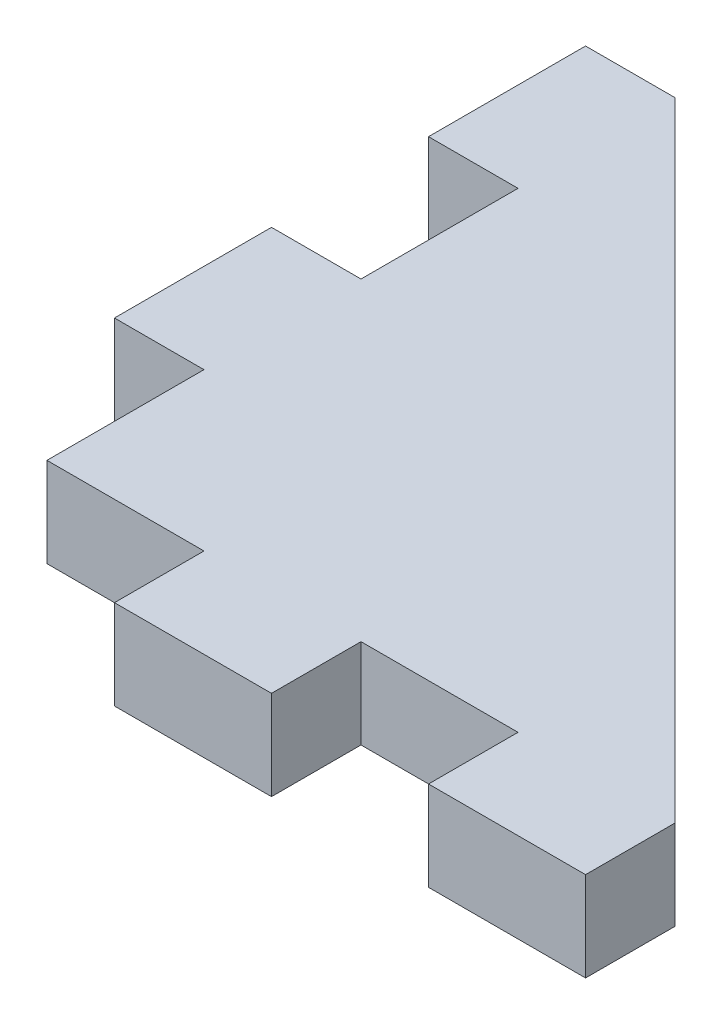
ISO-10303-21;
HEADER;
FILE_DESCRIPTION(('STEP AP214'),'2;1');
FILE_NAME('part.step','',(''),(''),'','','');
FILE_SCHEMA(('AUTOMOTIVE_DESIGN { 1 0 10303 214 1 1 1 1 }'));
ENDSEC;
DATA;
#1=APPLICATION_CONTEXT('core data for automotive mechanical design processes');
#2=APPLICATION_PROTOCOL_DEFINITION('international standard','automotive_design',2000,#1);
#3=PRODUCT_CONTEXT('',#1,'mechanical');
#4=PRODUCT('Part','Part','',(#3));
#5=PRODUCT_RELATED_PRODUCT_CATEGORY('part','',(#4));
#6=PRODUCT_DEFINITION_FORMATION('','',#4);
#7=PRODUCT_DEFINITION_CONTEXT('part definition',#1,'design');
#8=PRODUCT_DEFINITION('design','',#6,#7);
#9=PRODUCT_DEFINITION_SHAPE('','',#8);
#10=(LENGTH_UNIT() NAMED_UNIT(*) SI_UNIT(.MILLI.,.METRE.));
#11=(NAMED_UNIT(*) PLANE_ANGLE_UNIT() SI_UNIT($,.RADIAN.));
#12=(NAMED_UNIT(*) SI_UNIT($,.STERADIAN.) SOLID_ANGLE_UNIT());
#13=UNCERTAINTY_MEASURE_WITH_UNIT(LENGTH_MEASURE(1.E-05),#10,'distance_accuracy_value','');
#14=(GEOMETRIC_REPRESENTATION_CONTEXT(3) GLOBAL_UNCERTAINTY_ASSIGNED_CONTEXT((#13)) GLOBAL_UNIT_ASSIGNED_CONTEXT((#10,
#11,#12)) REPRESENTATION_CONTEXT('',''));
#15=CARTESIAN_POINT('',(0.,0.,0.));
#16=DIRECTION('',(0.,0.,1.));
#17=DIRECTION('',(1.,0.,0.));
#18=AXIS2_PLACEMENT_3D('',#15,#16,#17);
#19=CARTESIAN_POINT('',(5.7,5.7,77.1));
#20=DIRECTION('',(0.707106781186547,0.,-0.707106781186548));
#21=DIRECTION('',(-0.707106781186548,0.,-0.707106781186547));
#22=AXIS2_PLACEMENT_3D('',#19,#20,#21);
#23=PLANE('',#22);
#24=DIRECTION('',(0.707106781186548,0.,0.707106781186547));
#25=VECTOR('',#24,1.);
#26=CARTESIAN_POINT('',(5.7,0.,77.1));
#27=LINE('',#26,#25);
#28=CARTESIAN_POINT('',(5.7,0.,77.1));
#29=VERTEX_POINT('',#28);
#30=CARTESIAN_POINT('',(45.7,0.,117.1));
#31=VERTEX_POINT('',#30);
#32=EDGE_CURVE('E184',#29,#31,#27,.T.);
#33=ORIENTED_EDGE('',*,*,#32,.F.);
#34=DIRECTION('',(0.,-1.,0.));
#35=VECTOR('',#34,1.);
#36=CARTESIAN_POINT('',(5.7,5.7,77.1));
#37=LINE('',#36,#35);
#38=CARTESIAN_POINT('',(5.7,5.7,77.1));
#39=VERTEX_POINT('',#38);
#40=EDGE_CURVE('E11',#39,#29,#37,.T.);
#41=ORIENTED_EDGE('',*,*,#40,.F.);
#42=DIRECTION('',(0.707106781186548,0.,0.707106781186547));
#43=VECTOR('',#42,1.);
#44=CARTESIAN_POINT('',(5.7,5.7,77.1));
#45=LINE('',#44,#43);
#46=CARTESIAN_POINT('',(45.7,5.7,117.1));
#47=VERTEX_POINT('',#46);
#48=EDGE_CURVE('E231',#39,#47,#45,.T.);
#49=ORIENTED_EDGE('',*,*,#48,.T.);
#50=DIRECTION('',(0.,-1.,0.));
#51=VECTOR('',#50,1.);
#52=CARTESIAN_POINT('',(45.7,5.7,117.1));
#53=LINE('',#52,#51);
#54=EDGE_CURVE('E36',#47,#31,#53,.T.);
#55=ORIENTED_EDGE('',*,*,#54,.T.);
#56=EDGE_LOOP('',(#33,#41,#49,#55));
#57=FACE_BOUND('',#56,.T.);
#58=ADVANCED_FACE('F33',(#57),#23,.T.);
#59=CARTESIAN_POINT('',(0.,5.7,77.1));
#60=DIRECTION('',(0.,0.,-1.));
#61=DIRECTION('',(-1.,0.,0.));
#62=AXIS2_PLACEMENT_3D('',#59,#60,#61);
#63=PLANE('',#62);
#64=DIRECTION('',(1.,0.,0.));
#65=VECTOR('',#64,1.);
#66=CARTESIAN_POINT('',(0.,0.,77.1));
#67=LINE('',#66,#65);
#68=CARTESIAN_POINT('',(0.,0.,77.1));
#69=VERTEX_POINT('',#68);
#70=EDGE_CURVE('E229',#69,#29,#67,.T.);
#71=ORIENTED_EDGE('',*,*,#70,.F.);
#72=DIRECTION('',(0.,-1.,0.));
#73=VECTOR('',#72,1.);
#74=CARTESIAN_POINT('',(0.,5.7,77.1));
#75=LINE('',#74,#73);
#76=CARTESIAN_POINT('',(0.,5.7,77.1));
#77=VERTEX_POINT('',#76);
#78=EDGE_CURVE('E42',#77,#69,#75,.T.);
#79=ORIENTED_EDGE('',*,*,#78,.F.);
#80=DIRECTION('',(1.,0.,0.));
#81=VECTOR('',#80,1.);
#82=CARTESIAN_POINT('',(0.,5.7,77.1));
#83=LINE('',#82,#81);
#84=EDGE_CURVE('E174',#77,#39,#83,.T.);
#85=ORIENTED_EDGE('',*,*,#84,.T.);
#86=ORIENTED_EDGE('',*,*,#40,.T.);
#87=EDGE_LOOP('',(#71,#79,#85,#86));
#88=FACE_BOUND('',#87,.T.);
#89=ADVANCED_FACE('F261',(#88),#63,.T.);
#90=CARTESIAN_POINT('',(0.,5.7,87.1));
#91=DIRECTION('',(-1.,0.,0.));
#92=DIRECTION('',(0.,0.,1.));
#93=AXIS2_PLACEMENT_3D('',#90,#91,#92);
#94=PLANE('',#93);
#95=DIRECTION('',(0.,0.,-1.));
#96=VECTOR('',#95,1.);
#97=CARTESIAN_POINT('',(0.,0.,87.1));
#98=LINE('',#97,#96);
#99=CARTESIAN_POINT('',(0.,0.,87.1));
#100=VERTEX_POINT('',#99);
#101=EDGE_CURVE('E161',#100,#69,#98,.T.);
#102=ORIENTED_EDGE('',*,*,#101,.F.);
#103=DIRECTION('',(0.,-1.,0.));
#104=VECTOR('',#103,1.);
#105=CARTESIAN_POINT('',(0.,5.7,87.1));
#106=LINE('',#105,#104);
#107=CARTESIAN_POINT('',(0.,5.7,87.1));
#108=VERTEX_POINT('',#107);
#109=EDGE_CURVE('E156',#108,#100,#106,.T.);
#110=ORIENTED_EDGE('',*,*,#109,.F.);
#111=DIRECTION('',(0.,0.,-1.));
#112=VECTOR('',#111,1.);
#113=CARTESIAN_POINT('',(0.,5.7,87.1));
#114=LINE('',#113,#112);
#115=EDGE_CURVE('E159',#108,#77,#114,.T.);
#116=ORIENTED_EDGE('',*,*,#115,.T.);
#117=ORIENTED_EDGE('',*,*,#78,.T.);
#118=EDGE_LOOP('',(#102,#110,#116,#117));
#119=FACE_BOUND('',#118,.T.);
#120=ADVANCED_FACE('F158',(#119),#94,.T.);
#121=CARTESIAN_POINT('',(5.7,5.7,87.1));
#122=DIRECTION('',(0.,0.,1.));
#123=DIRECTION('',(1.,0.,0.));
#124=AXIS2_PLACEMENT_3D('',#121,#122,#123);
#125=PLANE('',#124);
#126=DIRECTION('',(-1.,0.,0.));
#127=VECTOR('',#126,1.);
#128=CARTESIAN_POINT('',(5.7,0.,87.1));
#129=LINE('',#128,#127);
#130=CARTESIAN_POINT('',(5.7,0.,87.1));
#131=VERTEX_POINT('',#130);
#132=EDGE_CURVE('E226',#131,#100,#129,.T.);
#133=ORIENTED_EDGE('',*,*,#132,.F.);
#134=DIRECTION('',(0.,-1.,0.));
#135=VECTOR('',#134,1.);
#136=CARTESIAN_POINT('',(5.7,5.7,87.1));
#137=LINE('',#136,#135);
#138=CARTESIAN_POINT('',(5.7,5.7,87.1));
#139=VERTEX_POINT('',#138);
#140=EDGE_CURVE('E166',#139,#131,#137,.T.);
#141=ORIENTED_EDGE('',*,*,#140,.F.);
#142=DIRECTION('',(-1.,0.,0.));
#143=VECTOR('',#142,1.);
#144=CARTESIAN_POINT('',(5.7,5.7,87.1));
#145=LINE('',#144,#143);
#146=EDGE_CURVE('E172',#139,#108,#145,.T.);
#147=ORIENTED_EDGE('',*,*,#146,.T.);
#148=ORIENTED_EDGE('',*,*,#109,.T.);
#149=EDGE_LOOP('',(#133,#141,#147,#148));
#150=FACE_BOUND('',#149,.T.);
#151=ADVANCED_FACE('F176',(#150),#125,.T.);
#152=CARTESIAN_POINT('',(5.7,5.7,97.1));
#153=DIRECTION('',(-1.,0.,0.));
#154=DIRECTION('',(0.,0.,1.));
#155=AXIS2_PLACEMENT_3D('',#152,#153,#154);
#156=PLANE('',#155);
#157=DIRECTION('',(0.,0.,-1.));
#158=VECTOR('',#157,1.);
#159=CARTESIAN_POINT('',(5.7,0.,97.1));
#160=LINE('',#159,#158);
#161=CARTESIAN_POINT('',(5.7,0.,97.1));
#162=VERTEX_POINT('',#161);
#163=EDGE_CURVE('E223',#162,#131,#160,.T.);
#164=ORIENTED_EDGE('',*,*,#163,.F.);
#165=DIRECTION('',(0.,-1.,0.));
#166=VECTOR('',#165,1.);
#167=CARTESIAN_POINT('',(5.7,5.7,97.1));
#168=LINE('',#167,#166);
#169=CARTESIAN_POINT('',(5.7,5.7,97.1));
#170=VERTEX_POINT('',#169);
#171=EDGE_CURVE('E235',#170,#162,#168,.T.);
#172=ORIENTED_EDGE('',*,*,#171,.F.);
#173=DIRECTION('',(0.,0.,-1.));
#174=VECTOR('',#173,1.);
#175=CARTESIAN_POINT('',(5.7,5.7,97.1));
#176=LINE('',#175,#174);
#177=EDGE_CURVE('E177',#170,#139,#176,.T.);
#178=ORIENTED_EDGE('',*,*,#177,.T.);
#179=ORIENTED_EDGE('',*,*,#140,.T.);
#180=EDGE_LOOP('',(#164,#172,#178,#179));
#181=FACE_BOUND('',#180,.T.);
#182=ADVANCED_FACE('F274',(#181),#156,.T.);
#183=CARTESIAN_POINT('',(0.,5.7,97.1));
#184=DIRECTION('',(0.,0.,-1.));
#185=DIRECTION('',(-1.,0.,0.));
#186=AXIS2_PLACEMENT_3D('',#183,#184,#185);
#187=PLANE('',#186);
#188=DIRECTION('',(1.,0.,0.));
#189=VECTOR('',#188,1.);
#190=CARTESIAN_POINT('',(0.,0.,97.1));
#191=LINE('',#190,#189);
#192=CARTESIAN_POINT('',(0.,0.,97.1));
#193=VERTEX_POINT('',#192);
#194=EDGE_CURVE('E220',#193,#162,#191,.T.);
#195=ORIENTED_EDGE('',*,*,#194,.F.);
#196=DIRECTION('',(0.,-1.,0.));
#197=VECTOR('',#196,1.);
#198=CARTESIAN_POINT('',(0.,5.7,97.1));
#199=LINE('',#198,#197);
#200=CARTESIAN_POINT('',(0.,5.7,97.1));
#201=VERTEX_POINT('',#200);
#202=EDGE_CURVE('E237',#201,#193,#199,.T.);
#203=ORIENTED_EDGE('',*,*,#202,.F.);
#204=DIRECTION('',(1.,0.,0.));
#205=VECTOR('',#204,1.);
#206=CARTESIAN_POINT('',(0.,5.7,97.1));
#207=LINE('',#206,#205);
#208=EDGE_CURVE('E179',#201,#170,#207,.T.);
#209=ORIENTED_EDGE('',*,*,#208,.T.);
#210=ORIENTED_EDGE('',*,*,#171,.T.);
#211=EDGE_LOOP('',(#195,#203,#209,#210));
#212=FACE_BOUND('',#211,.T.);
#213=ADVANCED_FACE('F277',(#212),#187,.T.);
#214=CARTESIAN_POINT('',(0.,5.7,107.1));
#215=DIRECTION('',(-1.,0.,0.));
#216=DIRECTION('',(0.,0.,1.));
#217=AXIS2_PLACEMENT_3D('',#214,#215,#216);
#218=PLANE('',#217);
#219=DIRECTION('',(0.,0.,-1.));
#220=VECTOR('',#219,1.);
#221=CARTESIAN_POINT('',(0.,0.,107.1));
#222=LINE('',#221,#220);
#223=CARTESIAN_POINT('',(0.,0.,107.1));
#224=VERTEX_POINT('',#223);
#225=EDGE_CURVE('E217',#224,#193,#222,.T.);
#226=ORIENTED_EDGE('',*,*,#225,.F.);
#227=DIRECTION('',(0.,-1.,0.));
#228=VECTOR('',#227,1.);
#229=CARTESIAN_POINT('',(0.,5.7,107.1));
#230=LINE('',#229,#228);
#231=CARTESIAN_POINT('',(0.,5.7,107.1));
#232=VERTEX_POINT('',#231);
#233=EDGE_CURVE('E239',#232,#224,#230,.T.);
#234=ORIENTED_EDGE('',*,*,#233,.F.);
#235=DIRECTION('',(0.,0.,-1.));
#236=VECTOR('',#235,1.);
#237=CARTESIAN_POINT('',(0.,5.7,107.1));
#238=LINE('',#237,#236);
#239=EDGE_CURVE('E475',#232,#201,#238,.T.);
#240=ORIENTED_EDGE('',*,*,#239,.T.);
#241=ORIENTED_EDGE('',*,*,#202,.T.);
#242=EDGE_LOOP('',(#226,#234,#240,#241));
#243=FACE_BOUND('',#242,.T.);
#244=ADVANCED_FACE('F281',(#243),#218,.T.);
#245=CARTESIAN_POINT('',(5.7,5.7,107.1));
#246=DIRECTION('',(0.,0.,1.));
#247=DIRECTION('',(1.,0.,0.));
#248=AXIS2_PLACEMENT_3D('',#245,#246,#247);
#249=PLANE('',#248);
#250=DIRECTION('',(-1.,0.,0.));
#251=VECTOR('',#250,1.);
#252=CARTESIAN_POINT('',(5.7,0.,107.1));
#253=LINE('',#252,#251);
#254=CARTESIAN_POINT('',(5.7,0.,107.1));
#255=VERTEX_POINT('',#254);
#256=EDGE_CURVE('E214',#255,#224,#253,.T.);
#257=ORIENTED_EDGE('',*,*,#256,.F.);
#258=DIRECTION('',(0.,-1.,0.));
#259=VECTOR('',#258,1.);
#260=CARTESIAN_POINT('',(5.7,5.7,107.1));
#261=LINE('',#260,#259);
#262=CARTESIAN_POINT('',(5.7,5.7,107.1));
#263=VERTEX_POINT('',#262);
#264=EDGE_CURVE('E241',#263,#255,#261,.T.);
#265=ORIENTED_EDGE('',*,*,#264,.F.);
#266=DIRECTION('',(-1.,0.,0.));
#267=VECTOR('',#266,1.);
#268=CARTESIAN_POINT('',(5.7,5.7,107.1));
#269=LINE('',#268,#267);
#270=EDGE_CURVE('E468',#263,#232,#269,.T.);
#271=ORIENTED_EDGE('',*,*,#270,.T.);
#272=ORIENTED_EDGE('',*,*,#233,.T.);
#273=EDGE_LOOP('',(#257,#265,#271,#272));
#274=FACE_BOUND('',#273,.T.);
#275=ADVANCED_FACE('F285',(#274),#249,.T.);
#276=CARTESIAN_POINT('',(5.7,5.7,117.1));
#277=DIRECTION('',(-1.,0.,0.));
#278=DIRECTION('',(0.,0.,1.));
#279=AXIS2_PLACEMENT_3D('',#276,#277,#278);
#280=PLANE('',#279);
#281=DIRECTION('',(0.,0.,-1.));
#282=VECTOR('',#281,1.);
#283=CARTESIAN_POINT('',(5.7,0.,117.1));
#284=LINE('',#283,#282);
#285=CARTESIAN_POINT('',(5.7,0.,117.1));
#286=VERTEX_POINT('',#285);
#287=EDGE_CURVE('E211',#286,#255,#284,.T.);
#288=ORIENTED_EDGE('',*,*,#287,.F.);
#289=DIRECTION('',(0.,-1.,0.));
#290=VECTOR('',#289,1.);
#291=CARTESIAN_POINT('',(5.7,5.7,117.1));
#292=LINE('',#291,#290);
#293=CARTESIAN_POINT('',(5.7,5.7,117.1));
#294=VERTEX_POINT('',#293);
#295=EDGE_CURVE('E243',#294,#286,#292,.T.);
#296=ORIENTED_EDGE('',*,*,#295,.F.);
#297=DIRECTION('',(0.,0.,-1.));
#298=VECTOR('',#297,1.);
#299=CARTESIAN_POINT('',(5.7,5.7,117.1));
#300=LINE('',#299,#298);
#301=EDGE_CURVE('E464',#294,#263,#300,.T.);
#302=ORIENTED_EDGE('',*,*,#301,.T.);
#303=ORIENTED_EDGE('',*,*,#264,.T.);
#304=EDGE_LOOP('',(#288,#296,#302,#303));
#305=FACE_BOUND('',#304,.T.);
#306=ADVANCED_FACE('F289',(#305),#280,.T.);
#307=CARTESIAN_POINT('',(15.7,5.7,117.1));
#308=DIRECTION('',(0.,0.,1.));
#309=DIRECTION('',(1.,0.,0.));
#310=AXIS2_PLACEMENT_3D('',#307,#308,#309);
#311=PLANE('',#310);
#312=DIRECTION('',(-1.,0.,0.));
#313=VECTOR('',#312,1.);
#314=CARTESIAN_POINT('',(15.7,0.,117.1));
#315=LINE('',#314,#313);
#316=CARTESIAN_POINT('',(15.7,0.,117.1));
#317=VERTEX_POINT('',#316);
#318=EDGE_CURVE('E208',#317,#286,#315,.T.);
#319=ORIENTED_EDGE('',*,*,#318,.F.);
#320=DIRECTION('',(0.,-1.,0.));
#321=VECTOR('',#320,1.);
#322=CARTESIAN_POINT('',(15.7,5.7,117.1));
#323=LINE('',#322,#321);
#324=CARTESIAN_POINT('',(15.7,5.7,117.1));
#325=VERTEX_POINT('',#324);
#326=EDGE_CURVE('E245',#325,#317,#323,.T.);
#327=ORIENTED_EDGE('',*,*,#326,.F.);
#328=DIRECTION('',(-1.,0.,0.));
#329=VECTOR('',#328,1.);
#330=CARTESIAN_POINT('',(15.7,5.7,117.1));
#331=LINE('',#330,#329);
#332=EDGE_CURVE('E480',#325,#294,#331,.T.);
#333=ORIENTED_EDGE('',*,*,#332,.T.);
#334=ORIENTED_EDGE('',*,*,#295,.T.);
#335=EDGE_LOOP('',(#319,#327,#333,#334));
#336=FACE_BOUND('',#335,.T.);
#337=ADVANCED_FACE('F293',(#336),#311,.T.);
#338=CARTESIAN_POINT('',(15.7,5.7,122.8));
#339=DIRECTION('',(-1.,0.,0.));
#340=DIRECTION('',(0.,0.,1.));
#341=AXIS2_PLACEMENT_3D('',#338,#339,#340);
#342=PLANE('',#341);
#343=DIRECTION('',(0.,0.,-1.));
#344=VECTOR('',#343,1.);
#345=CARTESIAN_POINT('',(15.7,0.,122.8));
#346=LINE('',#345,#344);
#347=CARTESIAN_POINT('',(15.7,0.,122.8));
#348=VERTEX_POINT('',#347);
#349=EDGE_CURVE('E205',#348,#317,#346,.T.);
#350=ORIENTED_EDGE('',*,*,#349,.F.);
#351=DIRECTION('',(0.,-1.,0.));
#352=VECTOR('',#351,1.);
#353=CARTESIAN_POINT('',(15.7,5.7,122.8));
#354=LINE('',#353,#352);
#355=CARTESIAN_POINT('',(15.7,5.7,122.8));
#356=VERTEX_POINT('',#355);
#357=EDGE_CURVE('E247',#356,#348,#354,.T.);
#358=ORIENTED_EDGE('',*,*,#357,.F.);
#359=DIRECTION('',(0.,0.,-1.));
#360=VECTOR('',#359,1.);
#361=CARTESIAN_POINT('',(15.7,5.7,122.8));
#362=LINE('',#361,#360);
#363=EDGE_CURVE('E457',#356,#325,#362,.T.);
#364=ORIENTED_EDGE('',*,*,#363,.T.);
#365=ORIENTED_EDGE('',*,*,#326,.T.);
#366=EDGE_LOOP('',(#350,#358,#364,#365));
#367=FACE_BOUND('',#366,.T.);
#368=ADVANCED_FACE('F297',(#367),#342,.T.);
#369=CARTESIAN_POINT('',(25.7,5.7,122.8));
#370=DIRECTION('',(0.,0.,1.));
#371=DIRECTION('',(1.,0.,0.));
#372=AXIS2_PLACEMENT_3D('',#369,#370,#371);
#373=PLANE('',#372);
#374=DIRECTION('',(-1.,0.,0.));
#375=VECTOR('',#374,1.);
#376=CARTESIAN_POINT('',(25.7,0.,122.8));
#377=LINE('',#376,#375);
#378=CARTESIAN_POINT('',(25.7,0.,122.8));
#379=VERTEX_POINT('',#378);
#380=EDGE_CURVE('E202',#379,#348,#377,.T.);
#381=ORIENTED_EDGE('',*,*,#380,.F.);
#382=DIRECTION('',(0.,-1.,0.));
#383=VECTOR('',#382,1.);
#384=CARTESIAN_POINT('',(25.7,5.7,122.8));
#385=LINE('',#384,#383);
#386=CARTESIAN_POINT('',(25.7,5.7,122.8));
#387=VERTEX_POINT('',#386);
#388=EDGE_CURVE('E249',#387,#379,#385,.T.);
#389=ORIENTED_EDGE('',*,*,#388,.F.);
#390=DIRECTION('',(-1.,0.,0.));
#391=VECTOR('',#390,1.);
#392=CARTESIAN_POINT('',(25.7,5.7,122.8));
#393=LINE('',#392,#391);
#394=EDGE_CURVE('E453',#387,#356,#393,.T.);
#395=ORIENTED_EDGE('',*,*,#394,.T.);
#396=ORIENTED_EDGE('',*,*,#357,.T.);
#397=EDGE_LOOP('',(#381,#389,#395,#396));
#398=FACE_BOUND('',#397,.T.);
#399=ADVANCED_FACE('F301',(#398),#373,.T.);
#400=CARTESIAN_POINT('',(25.7,5.7,117.1));
#401=DIRECTION('',(1.,0.,0.));
#402=DIRECTION('',(0.,0.,-1.));
#403=AXIS2_PLACEMENT_3D('',#400,#401,#402);
#404=PLANE('',#403);
#405=DIRECTION('',(0.,0.,1.));
#406=VECTOR('',#405,1.);
#407=CARTESIAN_POINT('',(25.7,0.,117.1));
#408=LINE('',#407,#406);
#409=CARTESIAN_POINT('',(25.7,0.,117.1));
#410=VERTEX_POINT('',#409);
#411=EDGE_CURVE('E199',#410,#379,#408,.T.);
#412=ORIENTED_EDGE('',*,*,#411,.F.);
#413=DIRECTION('',(0.,-1.,0.));
#414=VECTOR('',#413,1.);
#415=CARTESIAN_POINT('',(25.7,5.7,117.1));
#416=LINE('',#415,#414);
#417=CARTESIAN_POINT('',(25.7,5.7,117.1));
#418=VERTEX_POINT('',#417);
#419=EDGE_CURVE('E251',#418,#410,#416,.T.);
#420=ORIENTED_EDGE('',*,*,#419,.F.);
#421=DIRECTION('',(0.,0.,1.));
#422=VECTOR('',#421,1.);
#423=CARTESIAN_POINT('',(25.7,5.7,117.1));
#424=LINE('',#423,#422);
#425=EDGE_CURVE('E484',#418,#387,#424,.T.);
#426=ORIENTED_EDGE('',*,*,#425,.T.);
#427=ORIENTED_EDGE('',*,*,#388,.T.);
#428=EDGE_LOOP('',(#412,#420,#426,#427));
#429=FACE_BOUND('',#428,.T.);
#430=ADVANCED_FACE('F305',(#429),#404,.T.);
#431=CARTESIAN_POINT('',(35.7,5.7,117.1));
#432=DIRECTION('',(0.,0.,1.));
#433=DIRECTION('',(1.,0.,0.));
#434=AXIS2_PLACEMENT_3D('',#431,#432,#433);
#435=PLANE('',#434);
#436=DIRECTION('',(-1.,0.,0.));
#437=VECTOR('',#436,1.);
#438=CARTESIAN_POINT('',(35.7,0.,117.1));
#439=LINE('',#438,#437);
#440=CARTESIAN_POINT('',(35.7,0.,117.1));
#441=VERTEX_POINT('',#440);
#442=EDGE_CURVE('E196',#441,#410,#439,.T.);
#443=ORIENTED_EDGE('',*,*,#442,.F.);
#444=DIRECTION('',(0.,-1.,0.));
#445=VECTOR('',#444,1.);
#446=CARTESIAN_POINT('',(35.7,5.7,117.1));
#447=LINE('',#446,#445);
#448=CARTESIAN_POINT('',(35.7,5.7,117.1));
#449=VERTEX_POINT('',#448);
#450=EDGE_CURVE('E253',#449,#441,#447,.T.);
#451=ORIENTED_EDGE('',*,*,#450,.F.);
#452=DIRECTION('',(-1.,0.,0.));
#453=VECTOR('',#452,1.);
#454=CARTESIAN_POINT('',(35.7,5.7,117.1));
#455=LINE('',#454,#453);
#456=EDGE_CURVE('E446',#449,#418,#455,.T.);
#457=ORIENTED_EDGE('',*,*,#456,.T.);
#458=ORIENTED_EDGE('',*,*,#419,.T.);
#459=EDGE_LOOP('',(#443,#451,#457,#458));
#460=FACE_BOUND('',#459,.T.);
#461=ADVANCED_FACE('F309',(#460),#435,.T.);
#462=CARTESIAN_POINT('',(35.7,5.7,122.8));
#463=DIRECTION('',(-1.,0.,0.));
#464=DIRECTION('',(0.,0.,1.));
#465=AXIS2_PLACEMENT_3D('',#462,#463,#464);
#466=PLANE('',#465);
#467=DIRECTION('',(0.,0.,-1.));
#468=VECTOR('',#467,1.);
#469=CARTESIAN_POINT('',(35.7,0.,122.8));
#470=LINE('',#469,#468);
#471=CARTESIAN_POINT('',(35.7,0.,122.8));
#472=VERTEX_POINT('',#471);
#473=EDGE_CURVE('E193',#472,#441,#470,.T.);
#474=ORIENTED_EDGE('',*,*,#473,.F.);
#475=DIRECTION('',(0.,-1.,0.));
#476=VECTOR('',#475,1.);
#477=CARTESIAN_POINT('',(35.7,5.7,122.8));
#478=LINE('',#477,#476);
#479=CARTESIAN_POINT('',(35.7,5.7,122.8));
#480=VERTEX_POINT('',#479);
#481=EDGE_CURVE('E255',#480,#472,#478,.T.);
#482=ORIENTED_EDGE('',*,*,#481,.F.);
#483=DIRECTION('',(0.,0.,-1.));
#484=VECTOR('',#483,1.);
#485=CARTESIAN_POINT('',(35.7,5.7,122.8));
#486=LINE('',#485,#484);
#487=EDGE_CURVE('E442',#480,#449,#486,.T.);
#488=ORIENTED_EDGE('',*,*,#487,.T.);
#489=ORIENTED_EDGE('',*,*,#450,.T.);
#490=EDGE_LOOP('',(#474,#482,#488,#489));
#491=FACE_BOUND('',#490,.T.);
#492=ADVANCED_FACE('F313',(#491),#466,.T.);
#493=CARTESIAN_POINT('',(45.7,5.7,122.8));
#494=DIRECTION('',(0.,0.,1.));
#495=DIRECTION('',(1.,0.,0.));
#496=AXIS2_PLACEMENT_3D('',#493,#494,#495);
#497=PLANE('',#496);
#498=DIRECTION('',(-1.,0.,0.));
#499=VECTOR('',#498,1.);
#500=CARTESIAN_POINT('',(45.7,0.,122.8));
#501=LINE('',#500,#499);
#502=CARTESIAN_POINT('',(45.7,0.,122.8));
#503=VERTEX_POINT('',#502);
#504=EDGE_CURVE('E190',#503,#472,#501,.T.);
#505=ORIENTED_EDGE('',*,*,#504,.F.);
#506=DIRECTION('',(0.,-1.,0.));
#507=VECTOR('',#506,1.);
#508=CARTESIAN_POINT('',(45.7,5.7,122.8));
#509=LINE('',#508,#507);
#510=CARTESIAN_POINT('',(45.7,5.7,122.8));
#511=VERTEX_POINT('',#510);
#512=EDGE_CURVE('E256',#511,#503,#509,.T.);
#513=ORIENTED_EDGE('',*,*,#512,.F.);
#514=DIRECTION('',(-1.,0.,0.));
#515=VECTOR('',#514,1.);
#516=CARTESIAN_POINT('',(45.7,5.7,122.8));
#517=LINE('',#516,#515);
#518=EDGE_CURVE('E488',#511,#480,#517,.T.);
#519=ORIENTED_EDGE('',*,*,#518,.T.);
#520=ORIENTED_EDGE('',*,*,#481,.T.);
#521=EDGE_LOOP('',(#505,#513,#519,#520));
#522=FACE_BOUND('',#521,.T.);
#523=ADVANCED_FACE('F317',(#522),#497,.T.);
#524=CARTESIAN_POINT('',(45.7,5.7,117.1));
#525=DIRECTION('',(1.,0.,0.));
#526=DIRECTION('',(0.,0.,-1.));
#527=AXIS2_PLACEMENT_3D('',#524,#525,#526);
#528=PLANE('',#527);
#529=DIRECTION('',(0.,0.,1.));
#530=VECTOR('',#529,1.);
#531=CARTESIAN_POINT('',(45.7,0.,117.1));
#532=LINE('',#531,#530);
#533=EDGE_CURVE('E187',#31,#503,#532,.T.);
#534=ORIENTED_EDGE('',*,*,#533,.F.);
#535=ORIENTED_EDGE('',*,*,#54,.F.);
#536=DIRECTION('',(0.,0.,1.));
#537=VECTOR('',#536,1.);
#538=CARTESIAN_POINT('',(45.7,5.7,117.1));
#539=LINE('',#538,#537);
#540=EDGE_CURVE('E490',#47,#511,#539,.T.);
#541=ORIENTED_EDGE('',*,*,#540,.T.);
#542=ORIENTED_EDGE('',*,*,#512,.T.);
#543=EDGE_LOOP('',(#534,#535,#541,#542));
#544=FACE_BOUND('',#543,.T.);
#545=ADVANCED_FACE('F258',(#544),#528,.T.);
#546=CARTESIAN_POINT('',(0.,5.7,0.));
#547=DIRECTION('',(0.,-1.,0.));
#548=DIRECTION('',(0.,0.,-1.));
#549=AXIS2_PLACEMENT_3D('',#546,#547,#548);
#550=PLANE('',#549);
#551=ORIENTED_EDGE('',*,*,#48,.F.);
#552=ORIENTED_EDGE('',*,*,#84,.F.);
#553=ORIENTED_EDGE('',*,*,#115,.F.);
#554=ORIENTED_EDGE('',*,*,#146,.F.);
#555=ORIENTED_EDGE('',*,*,#177,.F.);
#556=ORIENTED_EDGE('',*,*,#208,.F.);
#557=ORIENTED_EDGE('',*,*,#239,.F.);
#558=ORIENTED_EDGE('',*,*,#270,.F.);
#559=ORIENTED_EDGE('',*,*,#301,.F.);
#560=ORIENTED_EDGE('',*,*,#332,.F.);
#561=ORIENTED_EDGE('',*,*,#363,.F.);
#562=ORIENTED_EDGE('',*,*,#394,.F.);
#563=ORIENTED_EDGE('',*,*,#425,.F.);
#564=ORIENTED_EDGE('',*,*,#456,.F.);
#565=ORIENTED_EDGE('',*,*,#487,.F.);
#566=ORIENTED_EDGE('',*,*,#518,.F.);
#567=ORIENTED_EDGE('',*,*,#540,.F.);
#568=EDGE_LOOP('',(#551,#552,#553,#554,#555,#556,#557,#558,#559,#560,#561,#562,#563,#564,#565,
#566,#567));
#569=FACE_BOUND('',#568,.T.);
#570=ADVANCED_FACE('F170',(#569),#550,.F.);
#571=CARTESIAN_POINT('',(0.,0.,0.));
#572=DIRECTION('',(0.,-1.,0.));
#573=DIRECTION('',(0.,0.,-1.));
#574=AXIS2_PLACEMENT_3D('',#571,#572,#573);
#575=PLANE('',#574);
#576=ORIENTED_EDGE('',*,*,#32,.T.);
#577=ORIENTED_EDGE('',*,*,#533,.T.);
#578=ORIENTED_EDGE('',*,*,#504,.T.);
#579=ORIENTED_EDGE('',*,*,#473,.T.);
#580=ORIENTED_EDGE('',*,*,#442,.T.);
#581=ORIENTED_EDGE('',*,*,#411,.T.);
#582=ORIENTED_EDGE('',*,*,#380,.T.);
#583=ORIENTED_EDGE('',*,*,#349,.T.);
#584=ORIENTED_EDGE('',*,*,#318,.T.);
#585=ORIENTED_EDGE('',*,*,#287,.T.);
#586=ORIENTED_EDGE('',*,*,#256,.T.);
#587=ORIENTED_EDGE('',*,*,#225,.T.);
#588=ORIENTED_EDGE('',*,*,#194,.T.);
#589=ORIENTED_EDGE('',*,*,#163,.T.);
#590=ORIENTED_EDGE('',*,*,#132,.T.);
#591=ORIENTED_EDGE('',*,*,#101,.T.);
#592=ORIENTED_EDGE('',*,*,#70,.T.);
#593=EDGE_LOOP('',(#576,#577,#578,#579,#580,#581,#582,#583,#584,#585,#586,#587,#588,#589,#590,
#591,#592));
#594=FACE_BOUND('',#593,.T.);
#595=ADVANCED_FACE('F260',(#594),#575,.T.);
#596=CLOSED_SHELL('',(#58,#89,#120,#151,#182,#213,#244,#275,#306,#337,#368,#399,#430,#461,#492,
#523,#545,#570,#595));
#597=MANIFOLD_SOLID_BREP('B2',#596);
#598=ADVANCED_BREP_SHAPE_REPRESENTATION('',(#18,#597),#14);
#599=SHAPE_DEFINITION_REPRESENTATION(#9,#598);
ENDSEC;
END-ISO-10303-21;
